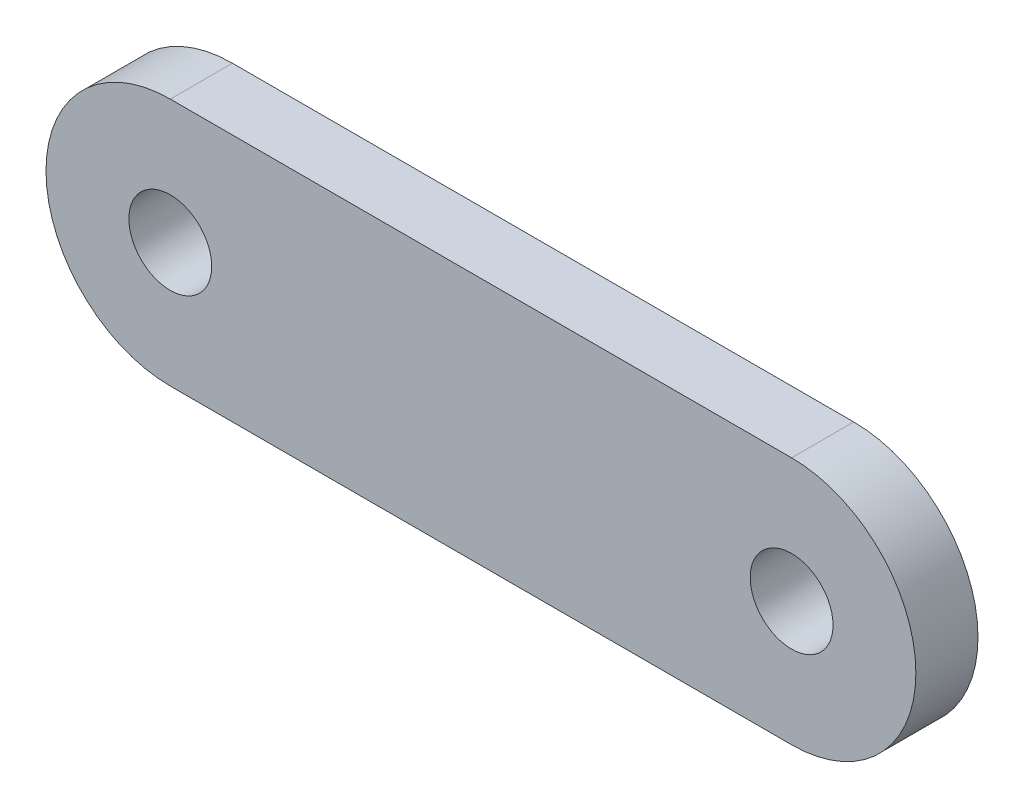
ISO-10303-21;
HEADER;
FILE_DESCRIPTION(('STEP AP214'),'2;1');
FILE_NAME('part.step','',(''),(''),'','','');
FILE_SCHEMA(('AUTOMOTIVE_DESIGN { 1 0 10303 214 1 1 1 1 }'));
ENDSEC;
DATA;
#1=APPLICATION_CONTEXT('core data for automotive mechanical design processes');
#2=APPLICATION_PROTOCOL_DEFINITION('international standard','automotive_design',2000,#1);
#3=PRODUCT_CONTEXT('',#1,'mechanical');
#4=PRODUCT('Part','Part','',(#3));
#5=PRODUCT_RELATED_PRODUCT_CATEGORY('part','',(#4));
#6=PRODUCT_DEFINITION_FORMATION('','',#4);
#7=PRODUCT_DEFINITION_CONTEXT('part definition',#1,'design');
#8=PRODUCT_DEFINITION('design','',#6,#7);
#9=PRODUCT_DEFINITION_SHAPE('','',#8);
#10=(LENGTH_UNIT() NAMED_UNIT(*) SI_UNIT(.MILLI.,.METRE.));
#11=(NAMED_UNIT(*) PLANE_ANGLE_UNIT() SI_UNIT($,.RADIAN.));
#12=(NAMED_UNIT(*) SI_UNIT($,.STERADIAN.) SOLID_ANGLE_UNIT());
#13=UNCERTAINTY_MEASURE_WITH_UNIT(LENGTH_MEASURE(1.E-05),#10,'distance_accuracy_value','');
#14=(GEOMETRIC_REPRESENTATION_CONTEXT(3) GLOBAL_UNCERTAINTY_ASSIGNED_CONTEXT((#13)) GLOBAL_UNIT_ASSIGNED_CONTEXT((#10,
#11,#12)) REPRESENTATION_CONTEXT('',''));
#15=CARTESIAN_POINT('',(0.,0.,0.));
#16=DIRECTION('',(0.,0.,1.));
#17=DIRECTION('',(1.,0.,0.));
#18=AXIS2_PLACEMENT_3D('',#15,#16,#17);
#19=CARTESIAN_POINT('',(-35.3127241673783,0.,3.));
#20=DIRECTION('',(0.,0.,1.));
#21=DIRECTION('',(1.,0.,0.));
#22=AXIS2_PLACEMENT_3D('',#19,#20,#21);
#23=PLANE('',#22);
#24=CARTESIAN_POINT('',(-35.3127241673783,0.,3.));
#25=DIRECTION('',(0.,0.,1.));
#26=DIRECTION('',(1.,0.,0.));
#27=AXIS2_PLACEMENT_3D('',#24,#25,#26);
#28=CIRCLE('',#27,2.);
#29=CARTESIAN_POINT('',(-33.3127241673783,0.,3.));
#30=VERTEX_POINT('',#29);
#31=EDGE_CURVE('E100',#30,#30,#28,.T.);
#32=ORIENTED_EDGE('',*,*,#31,.F.);
#33=EDGE_LOOP('',(#32));
#34=FACE_BOUND('',#33,.T.);
#35=CARTESIAN_POINT('',(-35.3127241673783,0.,3.));
#36=DIRECTION('',(0.,0.,1.));
#37=DIRECTION('',(1.,0.,0.));
#38=AXIS2_PLACEMENT_3D('',#35,#36,#37);
#39=CIRCLE('',#38,6.);
#40=CARTESIAN_POINT('',(-35.3127241673783,6.,3.));
#41=VERTEX_POINT('',#40);
#42=CARTESIAN_POINT('',(-35.3127241673783,-6.,3.));
#43=VERTEX_POINT('',#42);
#44=EDGE_CURVE('E85',#41,#43,#39,.T.);
#45=ORIENTED_EDGE('',*,*,#44,.T.);
#46=DIRECTION('',(1.,0.,0.));
#47=VECTOR('',#46,1.);
#48=CARTESIAN_POINT('',(-35.3127241673783,-6.,3.));
#49=LINE('',#48,#47);
#50=CARTESIAN_POINT('',(-5.3127241673783,-6.,3.));
#51=VERTEX_POINT('',#50);
#52=EDGE_CURVE('E80',#43,#51,#49,.T.);
#53=ORIENTED_EDGE('',*,*,#52,.T.);
#54=CARTESIAN_POINT('',(-5.3127241673783,0.,3.));
#55=DIRECTION('',(0.,0.,1.));
#56=DIRECTION('',(1.,0.,0.));
#57=AXIS2_PLACEMENT_3D('',#54,#55,#56);
#58=CIRCLE('',#57,6.);
#59=CARTESIAN_POINT('',(-5.3127241673783,6.,3.));
#60=VERTEX_POINT('',#59);
#61=EDGE_CURVE('E83',#51,#60,#58,.T.);
#62=ORIENTED_EDGE('',*,*,#61,.T.);
#63=DIRECTION('',(-1.,0.,0.));
#64=VECTOR('',#63,1.);
#65=CARTESIAN_POINT('',(-35.3127241673783,6.,3.));
#66=LINE('',#65,#64);
#67=EDGE_CURVE('E50',#60,#41,#66,.T.);
#68=ORIENTED_EDGE('',*,*,#67,.T.);
#69=EDGE_LOOP('',(#45,#53,#62,#68));
#70=FACE_BOUND('',#69,.T.);
#71=CARTESIAN_POINT('',(-5.3127241673783,0.,3.));
#72=DIRECTION('',(0.,0.,1.));
#73=DIRECTION('',(1.,0.,0.));
#74=AXIS2_PLACEMENT_3D('',#71,#72,#73);
#75=CIRCLE('',#74,2.);
#76=CARTESIAN_POINT('',(-3.3127241673783,0.,3.));
#77=VERTEX_POINT('',#76);
#78=EDGE_CURVE('E115',#77,#77,#75,.T.);
#79=ORIENTED_EDGE('',*,*,#78,.F.);
#80=EDGE_LOOP('',(#79));
#81=FACE_BOUND('',#80,.T.);
#82=ADVANCED_FACE('F33',(#34,#70,#81),#23,.T.);
#83=CARTESIAN_POINT('',(-35.3127241673783,0.,0.));
#84=DIRECTION('',(0.,0.,1.));
#85=DIRECTION('',(1.,0.,0.));
#86=AXIS2_PLACEMENT_3D('',#83,#84,#85);
#87=PLANE('',#86);
#88=CARTESIAN_POINT('',(-35.3127241673783,0.,0.));
#89=DIRECTION('',(0.,0.,1.));
#90=DIRECTION('',(1.,0.,0.));
#91=AXIS2_PLACEMENT_3D('',#88,#89,#90);
#92=CIRCLE('',#91,2.);
#93=CARTESIAN_POINT('',(-33.3127241673783,0.,0.));
#94=VERTEX_POINT('',#93);
#95=EDGE_CURVE('E112',#94,#94,#92,.T.);
#96=ORIENTED_EDGE('',*,*,#95,.T.);
#97=EDGE_LOOP('',(#96));
#98=FACE_BOUND('',#97,.T.);
#99=CARTESIAN_POINT('',(-35.3127241673783,0.,0.));
#100=DIRECTION('',(0.,0.,1.));
#101=DIRECTION('',(1.,0.,0.));
#102=AXIS2_PLACEMENT_3D('',#99,#100,#101);
#103=CIRCLE('',#102,6.);
#104=CARTESIAN_POINT('',(-35.3127241673783,6.,0.));
#105=VERTEX_POINT('',#104);
#106=CARTESIAN_POINT('',(-35.3127241673783,-6.,0.));
#107=VERTEX_POINT('',#106);
#108=EDGE_CURVE('E97',#105,#107,#103,.T.);
#109=ORIENTED_EDGE('',*,*,#108,.F.);
#110=DIRECTION('',(-1.,0.,0.));
#111=VECTOR('',#110,1.);
#112=CARTESIAN_POINT('',(-35.3127241673783,6.,0.));
#113=LINE('',#112,#111);
#114=CARTESIAN_POINT('',(-5.3127241673783,6.,0.));
#115=VERTEX_POINT('',#114);
#116=EDGE_CURVE('E73',#115,#105,#113,.T.);
#117=ORIENTED_EDGE('',*,*,#116,.F.);
#118=CARTESIAN_POINT('',(-5.3127241673783,0.,0.));
#119=DIRECTION('',(0.,0.,1.));
#120=DIRECTION('',(1.,0.,0.));
#121=AXIS2_PLACEMENT_3D('',#118,#119,#120);
#122=CIRCLE('',#121,6.);
#123=CARTESIAN_POINT('',(-5.3127241673783,-6.,0.));
#124=VERTEX_POINT('',#123);
#125=EDGE_CURVE('E67',#124,#115,#122,.T.);
#126=ORIENTED_EDGE('',*,*,#125,.F.);
#127=DIRECTION('',(1.,0.,0.));
#128=VECTOR('',#127,1.);
#129=CARTESIAN_POINT('',(-35.3127241673783,-6.,0.));
#130=LINE('',#129,#128);
#131=EDGE_CURVE('E89',#107,#124,#130,.T.);
#132=ORIENTED_EDGE('',*,*,#131,.F.);
#133=EDGE_LOOP('',(#109,#117,#126,#132));
#134=FACE_BOUND('',#133,.T.);
#135=CARTESIAN_POINT('',(-5.3127241673783,0.,0.));
#136=DIRECTION('',(0.,0.,1.));
#137=DIRECTION('',(1.,0.,0.));
#138=AXIS2_PLACEMENT_3D('',#135,#136,#137);
#139=CIRCLE('',#138,2.);
#140=CARTESIAN_POINT('',(-3.3127241673783,0.,0.));
#141=VERTEX_POINT('',#140);
#142=EDGE_CURVE('E118',#141,#141,#139,.T.);
#143=ORIENTED_EDGE('',*,*,#142,.T.);
#144=EDGE_LOOP('',(#143));
#145=FACE_BOUND('',#144,.T.);
#146=ADVANCED_FACE('F108',(#98,#134,#145),#87,.F.);
#147=CARTESIAN_POINT('',(-35.3127241673783,0.,3.));
#148=DIRECTION('',(0.,0.,-1.));
#149=DIRECTION('',(-1.,0.,0.));
#150=AXIS2_PLACEMENT_3D('',#147,#148,#149);
#151=CYLINDRICAL_SURFACE('',#150,6.);
#152=ORIENTED_EDGE('',*,*,#108,.T.);
#153=DIRECTION('',(0.,0.,-1.));
#154=VECTOR('',#153,1.);
#155=CARTESIAN_POINT('',(-35.3127241673783,-6.,3.));
#156=LINE('',#155,#154);
#157=EDGE_CURVE('E11',#43,#107,#156,.T.);
#158=ORIENTED_EDGE('',*,*,#157,.F.);
#159=ORIENTED_EDGE('',*,*,#44,.F.);
#160=DIRECTION('',(0.,0.,-1.));
#161=VECTOR('',#160,1.);
#162=CARTESIAN_POINT('',(-35.3127241673783,6.,3.));
#163=LINE('',#162,#161);
#164=EDGE_CURVE('E93',#41,#105,#163,.T.);
#165=ORIENTED_EDGE('',*,*,#164,.T.);
#166=EDGE_LOOP('',(#152,#158,#159,#165));
#167=FACE_BOUND('',#166,.T.);
#168=ADVANCED_FACE('F35',(#167),#151,.T.);
#169=CARTESIAN_POINT('',(-35.3127241673783,-6.,3.));
#170=DIRECTION('',(0.,1.,0.));
#171=DIRECTION('',(0.,0.,1.));
#172=AXIS2_PLACEMENT_3D('',#169,#170,#171);
#173=PLANE('',#172);
#174=ORIENTED_EDGE('',*,*,#131,.T.);
#175=DIRECTION('',(0.,0.,-1.));
#176=VECTOR('',#175,1.);
#177=CARTESIAN_POINT('',(-5.3127241673783,-6.,3.));
#178=LINE('',#177,#176);
#179=EDGE_CURVE('E42',#51,#124,#178,.T.);
#180=ORIENTED_EDGE('',*,*,#179,.F.);
#181=ORIENTED_EDGE('',*,*,#52,.F.);
#182=ORIENTED_EDGE('',*,*,#157,.T.);
#183=EDGE_LOOP('',(#174,#180,#181,#182));
#184=FACE_BOUND('',#183,.T.);
#185=ADVANCED_FACE('F88',(#184),#173,.F.);
#186=CARTESIAN_POINT('',(-5.3127241673783,0.,3.));
#187=DIRECTION('',(0.,0.,-1.));
#188=DIRECTION('',(-1.,0.,0.));
#189=AXIS2_PLACEMENT_3D('',#186,#187,#188);
#190=CYLINDRICAL_SURFACE('',#189,6.);
#191=ORIENTED_EDGE('',*,*,#125,.T.);
#192=DIRECTION('',(0.,0.,-1.));
#193=VECTOR('',#192,1.);
#194=CARTESIAN_POINT('',(-5.3127241673783,6.,3.));
#195=LINE('',#194,#193);
#196=EDGE_CURVE('E90',#60,#115,#195,.T.);
#197=ORIENTED_EDGE('',*,*,#196,.F.);
#198=ORIENTED_EDGE('',*,*,#61,.F.);
#199=ORIENTED_EDGE('',*,*,#179,.T.);
#200=EDGE_LOOP('',(#191,#197,#198,#199));
#201=FACE_BOUND('',#200,.T.);
#202=ADVANCED_FACE('F91',(#201),#190,.T.);
#203=CARTESIAN_POINT('',(-35.3127241673783,6.,3.));
#204=DIRECTION('',(0.,-1.,0.));
#205=DIRECTION('',(0.,0.,-1.));
#206=AXIS2_PLACEMENT_3D('',#203,#204,#205);
#207=PLANE('',#206);
#208=ORIENTED_EDGE('',*,*,#116,.T.);
#209=ORIENTED_EDGE('',*,*,#164,.F.);
#210=ORIENTED_EDGE('',*,*,#67,.F.);
#211=ORIENTED_EDGE('',*,*,#196,.T.);
#212=EDGE_LOOP('',(#208,#209,#210,#211));
#213=FACE_BOUND('',#212,.T.);
#214=ADVANCED_FACE('F105',(#213),#207,.F.);
#215=CARTESIAN_POINT('',(-35.3127241673783,0.,3.));
#216=DIRECTION('',(0.,0.,-1.));
#217=DIRECTION('',(-1.,0.,0.));
#218=AXIS2_PLACEMENT_3D('',#215,#216,#217);
#219=CYLINDRICAL_SURFACE('',#218,2.);
#220=ORIENTED_EDGE('',*,*,#31,.T.);
#221=EDGE_LOOP('',(#220));
#222=FACE_BOUND('',#221,.T.);
#223=ORIENTED_EDGE('',*,*,#95,.F.);
#224=EDGE_LOOP('',(#223));
#225=FACE_BOUND('',#224,.T.);
#226=ADVANCED_FACE('F136',(#222,#225),#219,.F.);
#227=CARTESIAN_POINT('',(-5.3127241673783,0.,3.));
#228=DIRECTION('',(0.,0.,-1.));
#229=DIRECTION('',(-1.,0.,0.));
#230=AXIS2_PLACEMENT_3D('',#227,#228,#229);
#231=CYLINDRICAL_SURFACE('',#230,2.);
#232=ORIENTED_EDGE('',*,*,#78,.T.);
#233=EDGE_LOOP('',(#232));
#234=FACE_BOUND('',#233,.T.);
#235=ORIENTED_EDGE('',*,*,#142,.F.);
#236=EDGE_LOOP('',(#235));
#237=FACE_BOUND('',#236,.T.);
#238=ADVANCED_FACE('F124',(#234,#237),#231,.F.);
#239=CLOSED_SHELL('',(#82,#146,#168,#185,#202,#214,#226,#238));
#240=MANIFOLD_SOLID_BREP('B2',#239);
#241=ADVANCED_BREP_SHAPE_REPRESENTATION('',(#18,#240),#14);
#242=SHAPE_DEFINITION_REPRESENTATION(#9,#241);
ENDSEC;
END-ISO-10303-21;
